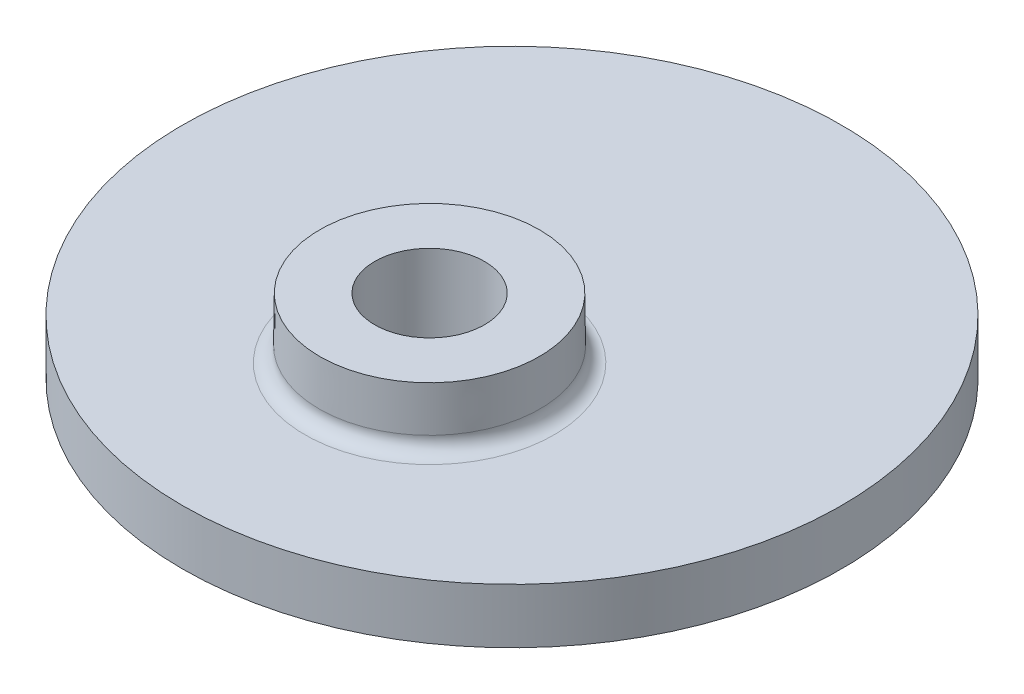
ISO-10303-21;
HEADER;
FILE_DESCRIPTION(('STEP AP214'),'2;1');
FILE_NAME('part.step','',(''),(''),'','','');
FILE_SCHEMA(('AUTOMOTIVE_DESIGN { 1 0 10303 214 1 1 1 1 }'));
ENDSEC;
DATA;
#1=APPLICATION_CONTEXT('core data for automotive mechanical design processes');
#2=APPLICATION_PROTOCOL_DEFINITION('international standard','automotive_design',2000,#1);
#3=PRODUCT_CONTEXT('',#1,'mechanical');
#4=PRODUCT('Part','Part','',(#3));
#5=PRODUCT_RELATED_PRODUCT_CATEGORY('part','',(#4));
#6=PRODUCT_DEFINITION_FORMATION('','',#4);
#7=PRODUCT_DEFINITION_CONTEXT('part definition',#1,'design');
#8=PRODUCT_DEFINITION('design','',#6,#7);
#9=PRODUCT_DEFINITION_SHAPE('','',#8);
#10=(LENGTH_UNIT() NAMED_UNIT(*) SI_UNIT(.MILLI.,.METRE.));
#11=(NAMED_UNIT(*) PLANE_ANGLE_UNIT() SI_UNIT($,.RADIAN.));
#12=(NAMED_UNIT(*) SI_UNIT($,.STERADIAN.) SOLID_ANGLE_UNIT());
#13=UNCERTAINTY_MEASURE_WITH_UNIT(LENGTH_MEASURE(1.E-05),#10,'distance_accuracy_value','');
#14=(GEOMETRIC_REPRESENTATION_CONTEXT(3) GLOBAL_UNCERTAINTY_ASSIGNED_CONTEXT((#13)) GLOBAL_UNIT_ASSIGNED_CONTEXT((#10,
#11,#12)) REPRESENTATION_CONTEXT('',''));
#15=CARTESIAN_POINT('',(0.,0.,0.));
#16=DIRECTION('',(0.,0.,1.));
#17=DIRECTION('',(1.,0.,0.));
#18=AXIS2_PLACEMENT_3D('',#15,#16,#17);
#19=CARTESIAN_POINT('',(61.3513513513514,-2.5,0.));
#20=DIRECTION('',(0.,-1.,0.));
#21=DIRECTION('',(0.,0.,-1.));
#22=AXIS2_PLACEMENT_3D('',#19,#20,#21);
#23=PLANE('',#22);
#24=CARTESIAN_POINT('',(0.,-2.50000000000006,0.));
#25=DIRECTION('',(0.,-1.,0.));
#26=DIRECTION('',(0.,0.,-1.));
#27=AXIS2_PLACEMENT_3D('',#24,#25,#26);
#28=CIRCLE('',#27,11.3513513513514);
#29=CARTESIAN_POINT('',(0.,-2.50000000000006,-11.3513513513514));
#30=VERTEX_POINT('',#29);
#31=EDGE_CURVE('E97',#30,#30,#28,.T.);
#32=ORIENTED_EDGE('',*,*,#31,.F.);
#33=EDGE_LOOP('',(#32));
#34=FACE_BOUND('',#33,.T.);
#35=CARTESIAN_POINT('',(0.,-2.5,-7.5));
#36=DIRECTION('',(0.,-1.,0.));
#37=DIRECTION('',(0.,0.,-1.));
#38=AXIS2_PLACEMENT_3D('',#35,#36,#37);
#39=CIRCLE('',#38,30.);
#40=CARTESIAN_POINT('',(0.,-2.5,-37.5));
#41=VERTEX_POINT('',#40);
#42=EDGE_CURVE('E119',#41,#41,#39,.T.);
#43=ORIENTED_EDGE('',*,*,#42,.T.);
#44=EDGE_LOOP('',(#43));
#45=FACE_BOUND('',#44,.T.);
#46=ADVANCED_FACE('F79',(#34,#45),#23,.T.);
#47=CARTESIAN_POINT('',(11.3480364748302,2.5,0.));
#48=DIRECTION('',(0.,1.,0.));
#49=DIRECTION('',(0.,0.,1.));
#50=AXIS2_PLACEMENT_3D('',#47,#48,#49);
#51=PLANE('',#50);
#52=CARTESIAN_POINT('',(0.,2.49999999999995,0.));
#53=DIRECTION('',(0.,-1.,0.));
#54=DIRECTION('',(0.,0.,-1.));
#55=AXIS2_PLACEMENT_3D('',#52,#53,#54);
#56=CIRCLE('',#55,11.3480364748302);
#57=CARTESIAN_POINT('',(0.,2.49999999999995,-11.3480364748302));
#58=VERTEX_POINT('',#57);
#59=EDGE_CURVE('E103',#58,#58,#56,.T.);
#60=ORIENTED_EDGE('',*,*,#59,.T.);
#61=EDGE_LOOP('',(#60));
#62=FACE_BOUND('',#61,.T.);
#63=CARTESIAN_POINT('',(0.,2.5,-7.5));
#64=DIRECTION('',(0.,1.,0.));
#65=DIRECTION('',(0.,0.,1.));
#66=AXIS2_PLACEMENT_3D('',#63,#64,#65);
#67=CIRCLE('',#66,30.);
#68=CARTESIAN_POINT('',(0.,2.5,22.5));
#69=VERTEX_POINT('',#68);
#70=EDGE_CURVE('E123',#69,#69,#67,.T.);
#71=ORIENTED_EDGE('',*,*,#70,.T.);
#72=EDGE_LOOP('',(#71));
#73=FACE_BOUND('',#72,.T.);
#74=ADVANCED_FACE('F128',(#62,#73),#51,.T.);
#75=CARTESIAN_POINT('',(0.,-587.78463502873,0.));
#76=DIRECTION('',(0.,-1.,0.));
#77=DIRECTION('',(0.,0.,-1.));
#78=AXIS2_PLACEMENT_3D('',#75,#76,#77);
#79=CYLINDRICAL_SURFACE('',#78,5.);
#80=CARTESIAN_POINT('',(0.,-8.00000000000001,0.));
#81=DIRECTION('',(0.,-1.,0.));
#82=DIRECTION('',(0.,0.,-1.));
#83=AXIS2_PLACEMENT_3D('',#80,#81,#82);
#84=CIRCLE('',#83,5.);
#85=CARTESIAN_POINT('',(0.,-8.00000000000001,-5.));
#86=VERTEX_POINT('',#85);
#87=EDGE_CURVE('E12',#86,#86,#84,.T.);
#88=ORIENTED_EDGE('',*,*,#87,.T.);
#89=EDGE_LOOP('',(#88));
#90=FACE_BOUND('',#89,.T.);
#91=CARTESIAN_POINT('',(0.,8.00000000000001,0.));
#92=DIRECTION('',(0.,-1.,0.));
#93=DIRECTION('',(0.,0.,-1.));
#94=AXIS2_PLACEMENT_3D('',#91,#92,#93);
#95=CIRCLE('',#94,5.);
#96=CARTESIAN_POINT('',(0.,8.00000000000001,-5.));
#97=VERTEX_POINT('',#96);
#98=EDGE_CURVE('E115',#97,#97,#95,.T.);
#99=ORIENTED_EDGE('',*,*,#98,.F.);
#100=EDGE_LOOP('',(#99));
#101=FACE_BOUND('',#100,.T.);
#102=ADVANCED_FACE('F81',(#90,#101),#79,.F.);
#103=CARTESIAN_POINT('',(10.,-8.00000000000001,0.));
#104=DIRECTION('',(0.,-1.,0.));
#105=DIRECTION('',(0.,0.,-1.));
#106=AXIS2_PLACEMENT_3D('',#103,#104,#105);
#107=PLANE('',#106);
#108=CARTESIAN_POINT('',(0.,-8.00000000000001,0.));
#109=DIRECTION('',(0.,-1.,0.));
#110=DIRECTION('',(0.,0.,-1.));
#111=AXIS2_PLACEMENT_3D('',#108,#109,#110);
#112=CIRCLE('',#111,10.);
#113=CARTESIAN_POINT('',(0.,-8.00000000000001,-10.));
#114=VERTEX_POINT('',#113);
#115=EDGE_CURVE('E87',#114,#114,#112,.T.);
#116=ORIENTED_EDGE('',*,*,#115,.T.);
#117=EDGE_LOOP('',(#116));
#118=FACE_BOUND('',#117,.T.);
#119=ORIENTED_EDGE('',*,*,#87,.F.);
#120=EDGE_LOOP('',(#119));
#121=FACE_BOUND('',#120,.T.);
#122=ADVANCED_FACE('F161',(#118,#121),#107,.T.);
#123=CARTESIAN_POINT('',(0.,-8.00000000000001,0.));
#124=DIRECTION('',(0.,1.,0.));
#125=DIRECTION('',(0.,0.,1.));
#126=AXIS2_PLACEMENT_3D('',#123,#124,#125);
#127=CONICAL_SURFACE('',#126,10.,0.0124966362164112);
#128=CARTESIAN_POINT('',(0.,-3.89099999999998,0.));
#129=DIRECTION('',(0.,-1.,0.));
#130=DIRECTION('',(0.,0.,-1.));
#131=AXIS2_PLACEMENT_3D('',#128,#129,#130);
#132=CIRCLE('',#131,10.0513513513514);
#133=CARTESIAN_POINT('',(0.,-3.89099999999998,-10.0513513513514));
#134=VERTEX_POINT('',#133);
#135=EDGE_CURVE('E92',#134,#134,#132,.T.);
#136=ORIENTED_EDGE('',*,*,#135,.T.);
#137=EDGE_LOOP('',(#136));
#138=FACE_BOUND('',#137,.T.);
#139=ORIENTED_EDGE('',*,*,#115,.F.);
#140=EDGE_LOOP('',(#139));
#141=FACE_BOUND('',#140,.T.);
#142=ADVANCED_FACE('F158',(#138,#141),#127,.T.);
#143=CARTESIAN_POINT('',(0.,-3.79999608810736,0.));
#144=DIRECTION('',(0.,-1.,0.));
#145=DIRECTION('',(0.,0.,-1.));
#146=AXIS2_PLACEMENT_3D('',#143,#144,#145);
#147=TOROIDAL_SURFACE('',#146,11.3481621656262,1.3);
#148=ORIENTED_EDGE('',*,*,#31,.T.);
#149=EDGE_LOOP('',(#148));
#150=FACE_BOUND('',#149,.T.);
#151=ORIENTED_EDGE('',*,*,#135,.F.);
#152=EDGE_LOOP('',(#151));
#153=FACE_BOUND('',#152,.T.);
#154=ADVANCED_FACE('F154',(#150,#153),#147,.F.);
#155=CARTESIAN_POINT('',(0.,3.8,0.));
#156=DIRECTION('',(0.,-1.,0.));
#157=DIRECTION('',(0.,0.,-1.));
#158=AXIS2_PLACEMENT_3D('',#155,#156,#157);
#159=TOROIDAL_SURFACE('',#158,11.3480364748302,1.3);
#160=CARTESIAN_POINT('',(0.,3.89099999999998,0.));
#161=DIRECTION('',(0.,-1.,0.));
#162=DIRECTION('',(0.,0.,-1.));
#163=AXIS2_PLACEMENT_3D('',#160,#161,#162);
#164=CIRCLE('',#163,10.0512253860435);
#165=CARTESIAN_POINT('',(0.,3.89099999999998,-10.0512253860435));
#166=VERTEX_POINT('',#165);
#167=EDGE_CURVE('E107',#166,#166,#164,.T.);
#168=ORIENTED_EDGE('',*,*,#167,.T.);
#169=EDGE_LOOP('',(#168));
#170=FACE_BOUND('',#169,.T.);
#171=ORIENTED_EDGE('',*,*,#59,.F.);
#172=EDGE_LOOP('',(#171));
#173=FACE_BOUND('',#172,.T.);
#174=ADVANCED_FACE('F157',(#170,#173),#159,.F.);
#175=CARTESIAN_POINT('',(0.,3.89099999999998,0.));
#176=DIRECTION('',(0.,-1.,0.));
#177=DIRECTION('',(0.,0.,-1.));
#178=AXIS2_PLACEMENT_3D('',#175,#176,#177);
#179=CONICAL_SURFACE('',#178,10.0512253860435,0.0124659850395936);
#180=CARTESIAN_POINT('',(0.,8.00000000000001,0.));
#181=DIRECTION('',(0.,-1.,0.));
#182=DIRECTION('',(0.,0.,-1.));
#183=AXIS2_PLACEMENT_3D('',#180,#181,#182);
#184=CIRCLE('',#183,10.);
#185=CARTESIAN_POINT('',(0.,8.00000000000001,-10.));
#186=VERTEX_POINT('',#185);
#187=EDGE_CURVE('E111',#186,#186,#184,.T.);
#188=ORIENTED_EDGE('',*,*,#187,.T.);
#189=EDGE_LOOP('',(#188));
#190=FACE_BOUND('',#189,.T.);
#191=ORIENTED_EDGE('',*,*,#167,.F.);
#192=EDGE_LOOP('',(#191));
#193=FACE_BOUND('',#192,.T.);
#194=ADVANCED_FACE('F139',(#190,#193),#179,.T.);
#195=CARTESIAN_POINT('',(5.,8.,0.));
#196=DIRECTION('',(0.,1.,0.));
#197=DIRECTION('',(0.,0.,1.));
#198=AXIS2_PLACEMENT_3D('',#195,#196,#197);
#199=PLANE('',#198);
#200=ORIENTED_EDGE('',*,*,#98,.T.);
#201=EDGE_LOOP('',(#200));
#202=FACE_BOUND('',#201,.T.);
#203=ORIENTED_EDGE('',*,*,#187,.F.);
#204=EDGE_LOOP('',(#203));
#205=FACE_BOUND('',#204,.T.);
#206=ADVANCED_FACE('F132',(#202,#205),#199,.T.);
#207=CARTESIAN_POINT('',(0.,-7.5,-7.5));
#208=DIRECTION('',(0.,1.,0.));
#209=DIRECTION('',(0.,0.,1.));
#210=AXIS2_PLACEMENT_3D('',#207,#208,#209);
#211=CYLINDRICAL_SURFACE('',#210,30.);
#212=ORIENTED_EDGE('',*,*,#42,.F.);
#213=EDGE_LOOP('',(#212));
#214=FACE_BOUND('',#213,.T.);
#215=ORIENTED_EDGE('',*,*,#70,.F.);
#216=EDGE_LOOP('',(#215));
#217=FACE_BOUND('',#216,.T.);
#218=ADVANCED_FACE('F130',(#214,#217),#211,.T.);
#219=CLOSED_SHELL('',(#46,#74,#102,#122,#142,#154,#174,#194,#206,#218));
#220=MANIFOLD_SOLID_BREP('B2',#219);
#221=ADVANCED_BREP_SHAPE_REPRESENTATION('',(#18,#220),#14);
#222=SHAPE_DEFINITION_REPRESENTATION(#9,#221);
ENDSEC;
END-ISO-10303-21;
